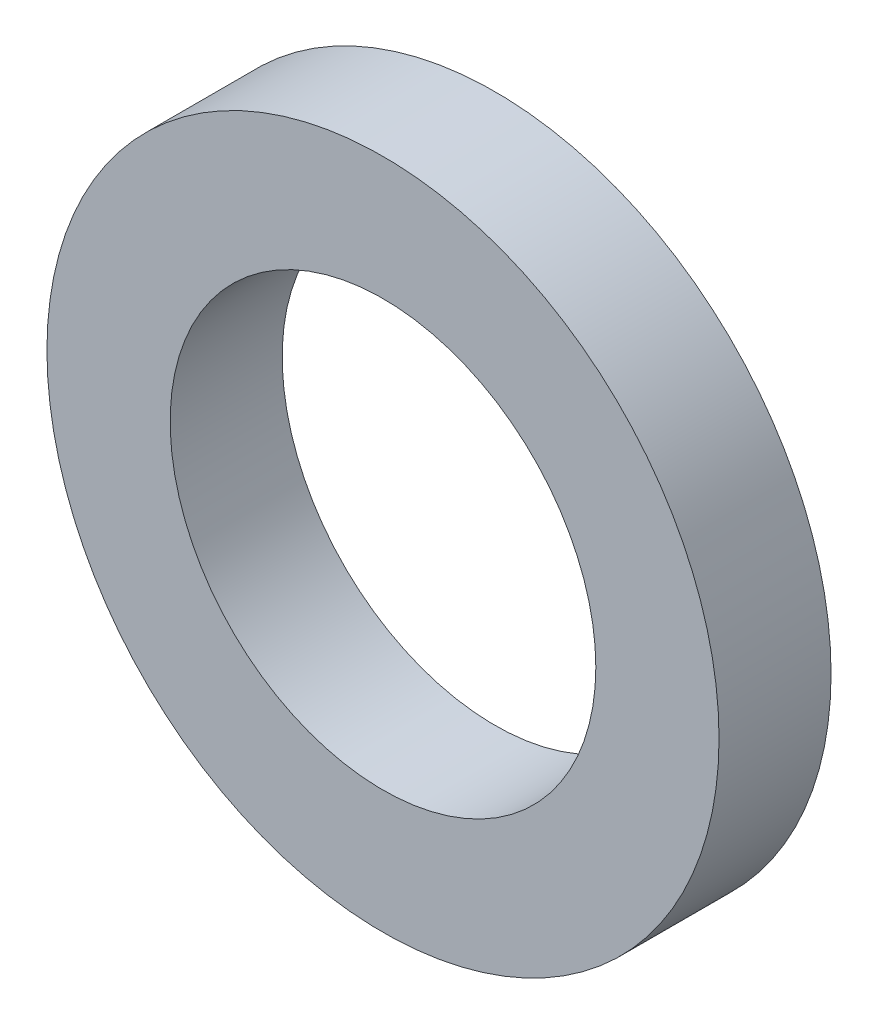
ISO-10303-21;
HEADER;
FILE_DESCRIPTION(('STEP AP214'),'2;1');
FILE_NAME('part.step','',(''),(''),'','','');
FILE_SCHEMA(('AUTOMOTIVE_DESIGN { 1 0 10303 214 1 1 1 1 }'));
ENDSEC;
DATA;
#1=APPLICATION_CONTEXT('core data for automotive mechanical design processes');
#2=APPLICATION_PROTOCOL_DEFINITION('international standard','automotive_design',2000,#1);
#3=PRODUCT_CONTEXT('',#1,'mechanical');
#4=PRODUCT('Part','Part','',(#3));
#5=PRODUCT_RELATED_PRODUCT_CATEGORY('part','',(#4));
#6=PRODUCT_DEFINITION_FORMATION('','',#4);
#7=PRODUCT_DEFINITION_CONTEXT('part definition',#1,'design');
#8=PRODUCT_DEFINITION('design','',#6,#7);
#9=PRODUCT_DEFINITION_SHAPE('','',#8);
#10=(LENGTH_UNIT() NAMED_UNIT(*) SI_UNIT(.MILLI.,.METRE.));
#11=(NAMED_UNIT(*) PLANE_ANGLE_UNIT() SI_UNIT($,.RADIAN.));
#12=(NAMED_UNIT(*) SI_UNIT($,.STERADIAN.) SOLID_ANGLE_UNIT());
#13=UNCERTAINTY_MEASURE_WITH_UNIT(LENGTH_MEASURE(1.E-05),#10,'distance_accuracy_value','');
#14=(GEOMETRIC_REPRESENTATION_CONTEXT(3) GLOBAL_UNCERTAINTY_ASSIGNED_CONTEXT((#13)) GLOBAL_UNIT_ASSIGNED_CONTEXT((#10,
#11,#12)) REPRESENTATION_CONTEXT('',''));
#15=CARTESIAN_POINT('',(0.,0.,0.));
#16=DIRECTION('',(0.,0.,1.));
#17=DIRECTION('',(1.,0.,0.));
#18=AXIS2_PLACEMENT_3D('',#15,#16,#17);
#19=CARTESIAN_POINT('',(0.,0.,1.));
#20=DIRECTION('',(0.,0.,1.));
#21=DIRECTION('',(1.,0.,0.));
#22=AXIS2_PLACEMENT_3D('',#19,#20,#21);
#23=PLANE('',#22);
#24=CARTESIAN_POINT('',(0.,0.,1.));
#25=DIRECTION('',(0.,0.,1.));
#26=DIRECTION('',(1.,0.,0.));
#27=AXIS2_PLACEMENT_3D('',#24,#25,#26);
#28=CIRCLE('',#27,3.);
#29=CARTESIAN_POINT('',(3.,0.,1.));
#30=VERTEX_POINT('',#29);
#31=EDGE_CURVE('E10',#30,#30,#28,.T.);
#32=ORIENTED_EDGE('',*,*,#31,.T.);
#33=EDGE_LOOP('',(#32));
#34=FACE_BOUND('',#33,.T.);
#35=CARTESIAN_POINT('',(0.,0.,1.));
#36=DIRECTION('',(0.,0.,1.));
#37=DIRECTION('',(1.,0.,0.));
#38=AXIS2_PLACEMENT_3D('',#35,#36,#37);
#39=CIRCLE('',#38,1.9);
#40=CARTESIAN_POINT('',(1.9,0.,1.));
#41=VERTEX_POINT('',#40);
#42=EDGE_CURVE('E44',#41,#41,#39,.T.);
#43=ORIENTED_EDGE('',*,*,#42,.F.);
#44=EDGE_LOOP('',(#43));
#45=FACE_BOUND('',#44,.T.);
#46=ADVANCED_FACE('F33',(#34,#45),#23,.T.);
#47=CARTESIAN_POINT('',(0.,0.,0.));
#48=DIRECTION('',(0.,0.,1.));
#49=DIRECTION('',(1.,0.,0.));
#50=AXIS2_PLACEMENT_3D('',#47,#48,#49);
#51=PLANE('',#50);
#52=CARTESIAN_POINT('',(0.,0.,0.));
#53=DIRECTION('',(0.,0.,1.));
#54=DIRECTION('',(1.,0.,0.));
#55=AXIS2_PLACEMENT_3D('',#52,#53,#54);
#56=CIRCLE('',#55,3.);
#57=CARTESIAN_POINT('',(3.,0.,0.));
#58=VERTEX_POINT('',#57);
#59=EDGE_CURVE('E37',#58,#58,#56,.T.);
#60=ORIENTED_EDGE('',*,*,#59,.F.);
#61=EDGE_LOOP('',(#60));
#62=FACE_BOUND('',#61,.T.);
#63=CARTESIAN_POINT('',(0.,0.,0.));
#64=DIRECTION('',(0.,0.,1.));
#65=DIRECTION('',(1.,0.,0.));
#66=AXIS2_PLACEMENT_3D('',#63,#64,#65);
#67=CIRCLE('',#66,1.9);
#68=CARTESIAN_POINT('',(1.9,0.,0.));
#69=VERTEX_POINT('',#68);
#70=EDGE_CURVE('E46',#69,#69,#67,.T.);
#71=ORIENTED_EDGE('',*,*,#70,.T.);
#72=EDGE_LOOP('',(#71));
#73=FACE_BOUND('',#72,.T.);
#74=ADVANCED_FACE('F56',(#62,#73),#51,.F.);
#75=CARTESIAN_POINT('',(0.,0.,1.));
#76=DIRECTION('',(0.,0.,-1.));
#77=DIRECTION('',(-1.,0.,0.));
#78=AXIS2_PLACEMENT_3D('',#75,#76,#77);
#79=CYLINDRICAL_SURFACE('',#78,3.);
#80=ORIENTED_EDGE('',*,*,#31,.F.);
#81=EDGE_LOOP('',(#80));
#82=FACE_BOUND('',#81,.T.);
#83=ORIENTED_EDGE('',*,*,#59,.T.);
#84=EDGE_LOOP('',(#83));
#85=FACE_BOUND('',#84,.T.);
#86=ADVANCED_FACE('F35',(#82,#85),#79,.T.);
#87=CARTESIAN_POINT('',(0.,0.,1.));
#88=DIRECTION('',(0.,0.,-1.));
#89=DIRECTION('',(-1.,0.,0.));
#90=AXIS2_PLACEMENT_3D('',#87,#88,#89);
#91=CYLINDRICAL_SURFACE('',#90,1.9);
#92=ORIENTED_EDGE('',*,*,#42,.T.);
#93=EDGE_LOOP('',(#92));
#94=FACE_BOUND('',#93,.T.);
#95=ORIENTED_EDGE('',*,*,#70,.F.);
#96=EDGE_LOOP('',(#95));
#97=FACE_BOUND('',#96,.T.);
#98=ADVANCED_FACE('F52',(#94,#97),#91,.F.);
#99=CLOSED_SHELL('',(#46,#74,#86,#98));
#100=MANIFOLD_SOLID_BREP('B2',#99);
#101=ADVANCED_BREP_SHAPE_REPRESENTATION('',(#18,#100),#14);
#102=SHAPE_DEFINITION_REPRESENTATION(#9,#101);
ENDSEC;
END-ISO-10303-21;
